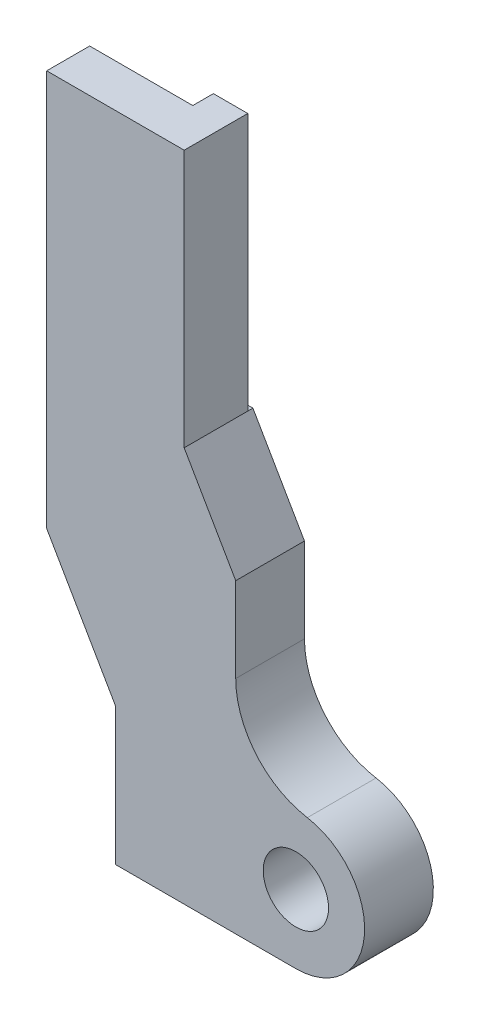
ISO-10303-21;
HEADER;
FILE_DESCRIPTION(('STEP AP214'),'2;1');
FILE_NAME('part.step','',(''),(''),'','','');
FILE_SCHEMA(('AUTOMOTIVE_DESIGN { 1 0 10303 214 1 1 1 1 }'));
ENDSEC;
DATA;
#1=APPLICATION_CONTEXT('core data for automotive mechanical design processes');
#2=APPLICATION_PROTOCOL_DEFINITION('international standard','automotive_design',2000,#1);
#3=PRODUCT_CONTEXT('',#1,'mechanical');
#4=PRODUCT('Part','Part','',(#3));
#5=PRODUCT_RELATED_PRODUCT_CATEGORY('part','',(#4));
#6=PRODUCT_DEFINITION_FORMATION('','',#4);
#7=PRODUCT_DEFINITION_CONTEXT('part definition',#1,'design');
#8=PRODUCT_DEFINITION('design','',#6,#7);
#9=PRODUCT_DEFINITION_SHAPE('','',#8);
#10=(LENGTH_UNIT() NAMED_UNIT(*) SI_UNIT(.MILLI.,.METRE.));
#11=(NAMED_UNIT(*) PLANE_ANGLE_UNIT() SI_UNIT($,.RADIAN.));
#12=(NAMED_UNIT(*) SI_UNIT($,.STERADIAN.) SOLID_ANGLE_UNIT());
#13=UNCERTAINTY_MEASURE_WITH_UNIT(LENGTH_MEASURE(1.E-05),#10,'distance_accuracy_value','');
#14=(GEOMETRIC_REPRESENTATION_CONTEXT(3) GLOBAL_UNCERTAINTY_ASSIGNED_CONTEXT((#13)) GLOBAL_UNIT_ASSIGNED_CONTEXT((#10,
#11,#12)) REPRESENTATION_CONTEXT('',''));
#15=CARTESIAN_POINT('',(0.,0.,0.));
#16=DIRECTION('',(0.,0.,1.));
#17=DIRECTION('',(1.,0.,0.));
#18=AXIS2_PLACEMENT_3D('',#15,#16,#17);
#19=CARTESIAN_POINT('',(-7.5,-4.,1.5));
#20=DIRECTION('',(0.,0.,1.));
#21=DIRECTION('',(1.,0.,0.));
#22=AXIS2_PLACEMENT_3D('',#19,#20,#21);
#23=PLANE('',#22);
#24=DIRECTION('',(0.5,-0.866025403784439,0.));
#25=VECTOR('',#24,1.);
#26=CARTESIAN_POINT('',(-8.5,4.,1.5));
#27=LINE('',#26,#25);
#28=CARTESIAN_POINT('',(-13.,11.79422863406,1.5));
#29=VERTEX_POINT('',#28);
#30=CARTESIAN_POINT('',(-8.5,4.,1.5));
#31=VERTEX_POINT('',#30);
#32=EDGE_CURVE('E220',#29,#31,#27,.T.);
#33=ORIENTED_EDGE('',*,*,#32,.F.);
#34=DIRECTION('',(0.,-1.,0.));
#35=VECTOR('',#34,1.);
#36=CARTESIAN_POINT('',(-13.,11.79422863406,1.5));
#37=LINE('',#36,#35);
#38=CARTESIAN_POINT('',(-13.,24.,1.5));
#39=VERTEX_POINT('',#38);
#40=EDGE_CURVE('E225',#39,#29,#37,.T.);
#41=ORIENTED_EDGE('',*,*,#40,.F.);
#42=DIRECTION('',(-1.,0.,0.));
#43=VECTOR('',#42,1.);
#44=CARTESIAN_POINT('',(-14.5,24.,1.5));
#45=LINE('',#44,#43);
#46=CARTESIAN_POINT('',(-14.5,24.,1.5));
#47=VERTEX_POINT('',#46);
#48=EDGE_CURVE('E482',#39,#47,#45,.T.);
#49=ORIENTED_EDGE('',*,*,#48,.T.);
#50=DIRECTION('',(0.,1.,0.));
#51=VECTOR('',#50,1.);
#52=CARTESIAN_POINT('',(-14.5,34.,1.5));
#53=LINE('',#52,#51);
#54=CARTESIAN_POINT('',(-14.5,34.,1.5));
#55=VERTEX_POINT('',#54);
#56=EDGE_CURVE('E473',#47,#55,#53,.T.);
#57=ORIENTED_EDGE('',*,*,#56,.T.);
#58=DIRECTION('',(1.,0.,0.));
#59=VECTOR('',#58,1.);
#60=CARTESIAN_POINT('',(-5.,34.,1.5));
#61=LINE('',#60,#59);
#62=CARTESIAN_POINT('',(-8.5,34.,1.5));
#63=VERTEX_POINT('',#62);
#64=EDGE_CURVE('E301',#55,#63,#61,.T.);
#65=ORIENTED_EDGE('',*,*,#64,.T.);
#66=DIRECTION('',(0.,-1.,0.));
#67=VECTOR('',#66,1.);
#68=CARTESIAN_POINT('',(-8.5,36.3323807579381,1.5));
#69=LINE('',#68,#67);
#70=CARTESIAN_POINT('',(-8.5,19.,1.5));
#71=VERTEX_POINT('',#70);
#72=EDGE_CURVE('E264',#63,#71,#69,.T.);
#73=ORIENTED_EDGE('',*,*,#72,.T.);
#74=DIRECTION('',(-0.499999999999995,0.866025403784442,0.));
#75=VECTOR('',#74,1.);
#76=CARTESIAN_POINT('',(-8.5,19.,1.5));
#77=LINE('',#76,#75);
#78=CARTESIAN_POINT('',(-4.5,12.0717967697244,1.5));
#79=VERTEX_POINT('',#78);
#80=EDGE_CURVE('E255',#79,#71,#77,.T.);
#81=ORIENTED_EDGE('',*,*,#80,.F.);
#82=DIRECTION('',(0.,1.,0.));
#83=VECTOR('',#82,1.);
#84=CARTESIAN_POINT('',(-4.5,-4.,1.5));
#85=LINE('',#84,#83);
#86=CARTESIAN_POINT('',(-4.5,-4.,1.5));
#87=VERTEX_POINT('',#86);
#88=EDGE_CURVE('E333',#87,#79,#85,.T.);
#89=ORIENTED_EDGE('',*,*,#88,.F.);
#90=DIRECTION('',(1.,0.,0.));
#91=VECTOR('',#90,1.);
#92=CARTESIAN_POINT('',(-7.5,-4.,1.5));
#93=LINE('',#92,#91);
#94=CARTESIAN_POINT('',(-7.5,-4.,1.5));
#95=VERTEX_POINT('',#94);
#96=EDGE_CURVE('E319',#95,#87,#93,.T.);
#97=ORIENTED_EDGE('',*,*,#96,.F.);
#98=DIRECTION('',(0.,1.,0.));
#99=VECTOR('',#98,1.);
#100=CARTESIAN_POINT('',(-7.5,-4.,1.5));
#101=LINE('',#100,#99);
#102=CARTESIAN_POINT('',(-7.5,4.,1.5));
#103=VERTEX_POINT('',#102);
#104=EDGE_CURVE('E325',#95,#103,#101,.T.);
#105=ORIENTED_EDGE('',*,*,#104,.T.);
#106=DIRECTION('',(-1.,0.,0.));
#107=VECTOR('',#106,1.);
#108=CARTESIAN_POINT('',(-5.,4.,1.5));
#109=LINE('',#108,#107);
#110=EDGE_CURVE('E299',#103,#31,#109,.T.);
#111=ORIENTED_EDGE('',*,*,#110,.T.);
#112=EDGE_LOOP('',(#33,#41,#49,#57,#65,#73,#81,#89,#97,#105,#111));
#113=FACE_BOUND('',#112,.T.);
#114=ADVANCED_FACE('F37',(#113),#23,.F.);
#115=CARTESIAN_POINT('',(0.,4.,4.));
#116=DIRECTION('',(0.,-1.,0.));
#117=DIRECTION('',(1.,0.,0.));
#118=AXIS2_PLACEMENT_3D('',#115,#116,#117);
#119=PLANE('',#118);
#120=DIRECTION('',(0.,0.,1.));
#121=VECTOR('',#120,1.);
#122=CARTESIAN_POINT('',(-8.5,4.,-31.5941170815567));
#123=LINE('',#122,#121);
#124=CARTESIAN_POINT('',(-8.5,4.,0.));
#125=VERTEX_POINT('',#124);
#126=EDGE_CURVE('E209',#125,#31,#123,.T.);
#127=ORIENTED_EDGE('',*,*,#126,.T.);
#128=ORIENTED_EDGE('',*,*,#110,.F.);
#129=DIRECTION('',(0.,0.,1.));
#130=VECTOR('',#129,1.);
#131=CARTESIAN_POINT('',(-7.5,4.,0.));
#132=LINE('',#131,#130);
#133=CARTESIAN_POINT('',(-7.5,4.,0.));
#134=VERTEX_POINT('',#133);
#135=EDGE_CURVE('E212',#134,#103,#132,.T.);
#136=ORIENTED_EDGE('',*,*,#135,.F.);
#137=DIRECTION('',(-1.,0.,0.));
#138=VECTOR('',#137,1.);
#139=CARTESIAN_POINT('',(0.,4.,0.));
#140=LINE('',#139,#138);
#141=EDGE_CURVE('E196',#134,#125,#140,.T.);
#142=ORIENTED_EDGE('',*,*,#141,.T.);
#143=EDGE_LOOP('',(#127,#128,#136,#142));
#144=FACE_BOUND('',#143,.T.);
#145=ADVANCED_FACE('F208',(#144),#119,.F.);
#146=CARTESIAN_POINT('',(-10.5,4.,4.));
#147=DIRECTION('',(1.,0.,0.));
#148=DIRECTION('',(0.,0.,-1.));
#149=AXIS2_PLACEMENT_3D('',#146,#147,#148);
#150=PLANE('',#149);
#151=DIRECTION('',(0.,-1.,0.));
#152=VECTOR('',#151,1.);
#153=CARTESIAN_POINT('',(-10.5,4.,4.));
#154=LINE('',#153,#152);
#155=CARTESIAN_POINT('',(-10.5,4.,4.));
#156=VERTEX_POINT('',#155);
#157=CARTESIAN_POINT('',(-10.5,-4.,4.));
#158=VERTEX_POINT('',#157);
#159=EDGE_CURVE('E345',#156,#158,#154,.T.);
#160=ORIENTED_EDGE('',*,*,#159,.F.);
#161=DIRECTION('',(0.,0.,-1.));
#162=VECTOR('',#161,1.);
#163=CARTESIAN_POINT('',(-10.5,4.,4.));
#164=LINE('',#163,#162);
#165=CARTESIAN_POINT('',(-10.5,4.,-1.));
#166=VERTEX_POINT('',#165);
#167=EDGE_CURVE('E357',#156,#166,#164,.T.);
#168=ORIENTED_EDGE('',*,*,#167,.T.);
#169=DIRECTION('',(0.,1.,0.));
#170=VECTOR('',#169,1.);
#171=CARTESIAN_POINT('',(-10.5,4.,-1.));
#172=LINE('',#171,#170);
#173=CARTESIAN_POINT('',(-10.5,-4.,-1.));
#174=VERTEX_POINT('',#173);
#175=EDGE_CURVE('E305',#174,#166,#172,.T.);
#176=ORIENTED_EDGE('',*,*,#175,.F.);
#177=DIRECTION('',(0.,0.,-1.));
#178=VECTOR('',#177,1.);
#179=CARTESIAN_POINT('',(-10.5,-4.,4.));
#180=LINE('',#179,#178);
#181=EDGE_CURVE('E355',#158,#174,#180,.T.);
#182=ORIENTED_EDGE('',*,*,#181,.F.);
#183=EDGE_LOOP('',(#160,#168,#176,#182));
#184=FACE_BOUND('',#183,.T.);
#185=ADVANCED_FACE('F404',(#184),#150,.F.);
#186=CARTESIAN_POINT('',(-4.5,-4.,0.));
#187=DIRECTION('',(1.,0.,0.));
#188=DIRECTION('',(0.,1.,0.));
#189=AXIS2_PLACEMENT_3D('',#186,#187,#188);
#190=PLANE('',#189);
#191=DIRECTION('',(0.,0.,1.));
#192=VECTOR('',#191,1.);
#193=CARTESIAN_POINT('',(-4.5,12.0717967697244,-8.00000000000009));
#194=LINE('',#193,#192);
#195=CARTESIAN_POINT('',(-4.5,12.0717967697244,0.));
#196=VERTEX_POINT('',#195);
#197=EDGE_CURVE('E260',#196,#79,#194,.T.);
#198=ORIENTED_EDGE('',*,*,#197,.F.);
#199=DIRECTION('',(0.,1.,0.));
#200=VECTOR('',#199,1.);
#201=CARTESIAN_POINT('',(-4.5,-4.,0.));
#202=LINE('',#201,#200);
#203=CARTESIAN_POINT('',(-4.5,-4.,0.));
#204=VERTEX_POINT('',#203);
#205=EDGE_CURVE('E330',#204,#196,#202,.T.);
#206=ORIENTED_EDGE('',*,*,#205,.F.);
#207=DIRECTION('',(0.,0.,-1.));
#208=VECTOR('',#207,1.);
#209=CARTESIAN_POINT('',(-4.5,-4.,0.));
#210=LINE('',#209,#208);
#211=EDGE_CURVE('E322',#87,#204,#210,.T.);
#212=ORIENTED_EDGE('',*,*,#211,.F.);
#213=ORIENTED_EDGE('',*,*,#88,.T.);
#214=EDGE_LOOP('',(#198,#206,#212,#213));
#215=FACE_BOUND('',#214,.T.);
#216=ADVANCED_FACE('F408',(#215),#190,.F.);
#217=CARTESIAN_POINT('',(0.,0.,0.));
#218=DIRECTION('',(0.,0.,1.));
#219=DIRECTION('',(1.,0.,0.));
#220=AXIS2_PLACEMENT_3D('',#217,#218,#219);
#221=PLANE('',#220);
#222=DIRECTION('',(0.,-1.,0.));
#223=VECTOR('',#222,1.);
#224=CARTESIAN_POINT('',(-9.5,4.,0.));
#225=LINE('',#224,#223);
#226=CARTESIAN_POINT('',(-9.5,5.73205080756888,0.));
#227=VERTEX_POINT('',#226);
#228=CARTESIAN_POINT('',(-9.5,-4.,0.));
#229=VERTEX_POINT('',#228);
#230=EDGE_CURVE('E199',#227,#229,#225,.T.);
#231=ORIENTED_EDGE('',*,*,#230,.F.);
#232=DIRECTION('',(0.5,-0.866025403784439,0.));
#233=VECTOR('',#232,1.);
#234=CARTESIAN_POINT('',(-9.79355865354369,6.24050931050806,0.));
#235=LINE('',#234,#233);
#236=EDGE_CURVE('E192',#227,#125,#235,.T.);
#237=ORIENTED_EDGE('',*,*,#236,.T.);
#238=ORIENTED_EDGE('',*,*,#141,.F.);
#239=DIRECTION('',(0.,1.,0.));
#240=VECTOR('',#239,1.);
#241=CARTESIAN_POINT('',(-7.5,-4.,0.));
#242=LINE('',#241,#240);
#243=CARTESIAN_POINT('',(-7.5,-4.,0.));
#244=VERTEX_POINT('',#243);
#245=EDGE_CURVE('E327',#244,#134,#242,.T.);
#246=ORIENTED_EDGE('',*,*,#245,.F.);
#247=DIRECTION('',(1.,0.,0.));
#248=VECTOR('',#247,1.);
#249=CARTESIAN_POINT('',(-10.5,-4.,0.));
#250=LINE('',#249,#248);
#251=EDGE_CURVE('E346',#229,#244,#250,.T.);
#252=ORIENTED_EDGE('',*,*,#251,.F.);
#253=EDGE_LOOP('',(#231,#237,#238,#246,#252));
#254=FACE_BOUND('',#253,.T.);
#255=ADVANCED_FACE('F194',(#254),#221,.F.);
#256=CARTESIAN_POINT('',(0.,0.,4.));
#257=DIRECTION('',(0.,0.,1.));
#258=DIRECTION('',(1.,0.,0.));
#259=AXIS2_PLACEMENT_3D('',#256,#257,#258);
#260=PLANE('',#259);
#261=DIRECTION('',(0.,1.,0.));
#262=VECTOR('',#261,1.);
#263=CARTESIAN_POINT('',(-6.5,34.,4.));
#264=LINE('',#263,#262);
#265=CARTESIAN_POINT('',(-6.5,19.,4.));
#266=VERTEX_POINT('',#265);
#267=CARTESIAN_POINT('',(-6.5,34.,4.));
#268=VERTEX_POINT('',#267);
#269=EDGE_CURVE('E248',#266,#268,#264,.T.);
#270=ORIENTED_EDGE('',*,*,#269,.T.);
#271=DIRECTION('',(-1.,0.,0.));
#272=VECTOR('',#271,1.);
#273=CARTESIAN_POINT('',(-5.,34.,4.));
#274=LINE('',#273,#272);
#275=CARTESIAN_POINT('',(-14.5,34.,4.));
#276=VERTEX_POINT('',#275);
#277=EDGE_CURVE('E298',#268,#276,#274,.T.);
#278=ORIENTED_EDGE('',*,*,#277,.T.);
#279=DIRECTION('',(0.,-1.,0.));
#280=VECTOR('',#279,1.);
#281=CARTESIAN_POINT('',(-14.5,34.,4.));
#282=LINE('',#281,#280);
#283=CARTESIAN_POINT('',(-14.5,10.9282032302755,4.));
#284=VERTEX_POINT('',#283);
#285=EDGE_CURVE('E231',#276,#284,#282,.T.);
#286=ORIENTED_EDGE('',*,*,#285,.T.);
#287=DIRECTION('',(0.5,-0.866025403784439,0.));
#288=VECTOR('',#287,1.);
#289=CARTESIAN_POINT('',(-14.5,10.9282032302755,4.));
#290=LINE('',#289,#288);
#291=EDGE_CURVE('E234',#284,#156,#290,.T.);
#292=ORIENTED_EDGE('',*,*,#291,.T.);
#293=ORIENTED_EDGE('',*,*,#159,.T.);
#294=DIRECTION('',(1.,0.,0.));
#295=VECTOR('',#294,1.);
#296=CARTESIAN_POINT('',(-10.5,-4.,4.));
#297=LINE('',#296,#295);
#298=CARTESIAN_POINT('',(0.,-4.,4.));
#299=VERTEX_POINT('',#298);
#300=EDGE_CURVE('E348',#158,#299,#297,.T.);
#301=ORIENTED_EDGE('',*,*,#300,.T.);
#302=CARTESIAN_POINT('',(0.,0.,4.));
#303=DIRECTION('',(0.,0.,1.));
#304=DIRECTION('',(1.,0.,0.));
#305=AXIS2_PLACEMENT_3D('',#302,#303,#304);
#306=CIRCLE('',#305,4.);
#307=CARTESIAN_POINT('',(0.666666666666667,3.94405318873308,4.));
#308=VERTEX_POINT('',#307);
#309=EDGE_CURVE('E343',#299,#308,#306,.T.);
#310=ORIENTED_EDGE('',*,*,#309,.T.);
#311=CARTESIAN_POINT('',(1.5,8.87411967464942,4.));
#312=DIRECTION('',(0.,0.,1.));
#313=DIRECTION('',(1.,0.,0.));
#314=AXIS2_PLACEMENT_3D('',#311,#312,#313);
#315=CIRCLE('',#314,5.);
#316=CARTESIAN_POINT('',(-3.5,8.87411967464942,4.));
#317=VERTEX_POINT('',#316);
#318=EDGE_CURVE('E11',#308,#317,#315,.F.);
#319=ORIENTED_EDGE('',*,*,#318,.T.);
#320=DIRECTION('',(0.,-1.,0.));
#321=VECTOR('',#320,1.);
#322=CARTESIAN_POINT('',(-3.5,19.,4.));
#323=LINE('',#322,#321);
#324=CARTESIAN_POINT('',(-3.5,13.8038475772934,4.));
#325=VERTEX_POINT('',#324);
#326=EDGE_CURVE('E295',#325,#317,#323,.T.);
#327=ORIENTED_EDGE('',*,*,#326,.F.);
#328=DIRECTION('',(-0.5,0.866025403784439,0.));
#329=VECTOR('',#328,1.);
#330=CARTESIAN_POINT('',(-6.5,19.,4.));
#331=LINE('',#330,#329);
#332=EDGE_CURVE('E245',#325,#266,#331,.T.);
#333=ORIENTED_EDGE('',*,*,#332,.T.);
#334=EDGE_LOOP('',(#270,#278,#286,#292,#293,#301,#310,#319,#327,#333));
#335=FACE_BOUND('',#334,.T.);
#336=CARTESIAN_POINT('',(0.,0.,4.));
#337=DIRECTION('',(0.,0.,1.));
#338=DIRECTION('',(1.,0.,0.));
#339=AXIS2_PLACEMENT_3D('',#336,#337,#338);
#340=CIRCLE('',#339,1.9);
#341=CARTESIAN_POINT('',(1.9,0.,4.));
#342=VERTEX_POINT('',#341);
#343=EDGE_CURVE('E338',#342,#342,#340,.T.);
#344=ORIENTED_EDGE('',*,*,#343,.F.);
#345=EDGE_LOOP('',(#344));
#346=FACE_BOUND('',#345,.T.);
#347=ADVANCED_FACE('F388',(#335,#346),#260,.T.);
#348=DIRECTION('',(-1.,0.,0.));
#349=VECTOR('',#348,1.);
#350=CARTESIAN_POINT('',(-3.5,19.,0.));
#351=LINE('',#350,#349);
#352=CARTESIAN_POINT('',(-6.5,19.,0.));
#353=VERTEX_POINT('',#352);
#354=CARTESIAN_POINT('',(-8.5,19.,0.));
#355=VERTEX_POINT('',#354);
#356=EDGE_CURVE('E280',#353,#355,#351,.T.);
#357=ORIENTED_EDGE('',*,*,#356,.F.);
#358=DIRECTION('',(-0.5,0.866025403784439,0.));
#359=VECTOR('',#358,1.);
#360=CARTESIAN_POINT('',(-6.5,19.,0.));
#361=LINE('',#360,#359);
#362=CARTESIAN_POINT('',(-3.5,13.8038475772934,0.));
#363=VERTEX_POINT('',#362);
#364=EDGE_CURVE('E251',#363,#353,#361,.T.);
#365=ORIENTED_EDGE('',*,*,#364,.F.);
#366=DIRECTION('',(0.,-1.,0.));
#367=VECTOR('',#366,1.);
#368=CARTESIAN_POINT('',(-3.5,19.,0.));
#369=LINE('',#368,#367);
#370=CARTESIAN_POINT('',(-3.5,8.87411967464942,0.));
#371=VERTEX_POINT('',#370);
#372=EDGE_CURVE('E293',#363,#371,#369,.T.);
#373=ORIENTED_EDGE('',*,*,#372,.T.);
#374=CARTESIAN_POINT('',(1.5,8.87411967464942,0.));
#375=DIRECTION('',(0.,0.,1.));
#376=DIRECTION('',(1.,0.,0.));
#377=AXIS2_PLACEMENT_3D('',#374,#375,#376);
#378=CIRCLE('',#377,5.);
#379=CARTESIAN_POINT('',(0.666666666666667,3.94405318873308,0.));
#380=VERTEX_POINT('',#379);
#381=EDGE_CURVE('E45',#371,#380,#378,.T.);
#382=ORIENTED_EDGE('',*,*,#381,.T.);
#383=CARTESIAN_POINT('',(0.,0.,0.));
#384=DIRECTION('',(0.,0.,1.));
#385=DIRECTION('',(1.,0.,0.));
#386=AXIS2_PLACEMENT_3D('',#383,#384,#385);
#387=CIRCLE('',#386,4.);
#388=CARTESIAN_POINT('',(0.,-4.,0.));
#389=VERTEX_POINT('',#388);
#390=EDGE_CURVE('E214',#389,#380,#387,.T.);
#391=ORIENTED_EDGE('',*,*,#390,.F.);
#392=EDGE_CURVE('E213',#204,#389,#250,.T.);
#393=ORIENTED_EDGE('',*,*,#392,.F.);
#394=ORIENTED_EDGE('',*,*,#205,.T.);
#395=DIRECTION('',(0.499999999999995,-0.866025403784442,0.));
#396=VECTOR('',#395,1.);
#397=CARTESIAN_POINT('',(-8.5,19.,0.));
#398=LINE('',#397,#396);
#399=EDGE_CURVE('E262',#355,#196,#398,.T.);
#400=ORIENTED_EDGE('',*,*,#399,.F.);
#401=EDGE_LOOP('',(#357,#365,#373,#382,#391,#393,#394,#400));
#402=FACE_BOUND('',#401,.T.);
#403=CARTESIAN_POINT('',(0.,0.,0.));
#404=DIRECTION('',(0.,0.,1.));
#405=DIRECTION('',(1.,0.,0.));
#406=AXIS2_PLACEMENT_3D('',#403,#404,#405);
#407=CIRCLE('',#406,1.9);
#408=CARTESIAN_POINT('',(1.9,0.,0.));
#409=VERTEX_POINT('',#408);
#410=EDGE_CURVE('E329',#409,#409,#407,.T.);
#411=ORIENTED_EDGE('',*,*,#410,.T.);
#412=EDGE_LOOP('',(#411));
#413=FACE_BOUND('',#412,.T.);
#414=ADVANCED_FACE('F372',(#402,#413),#221,.F.);
#415=CARTESIAN_POINT('',(0.,0.,4.));
#416=DIRECTION('',(0.,0.,-1.));
#417=DIRECTION('',(-1.,0.,0.));
#418=AXIS2_PLACEMENT_3D('',#415,#416,#417);
#419=CYLINDRICAL_SURFACE('',#418,4.);
#420=ORIENTED_EDGE('',*,*,#390,.T.);
#421=DIRECTION('',(0.,0.,-1.));
#422=VECTOR('',#421,1.);
#423=CARTESIAN_POINT('',(0.666666666666668,3.94405318873308,4.));
#424=LINE('',#423,#422);
#425=EDGE_CURVE('E52',#380,#308,#424,.F.);
#426=ORIENTED_EDGE('',*,*,#425,.T.);
#427=ORIENTED_EDGE('',*,*,#309,.F.);
#428=DIRECTION('',(0.,0.,-1.));
#429=VECTOR('',#428,1.);
#430=CARTESIAN_POINT('',(0.,-4.,4.));
#431=LINE('',#430,#429);
#432=EDGE_CURVE('E350',#299,#389,#431,.T.);
#433=ORIENTED_EDGE('',*,*,#432,.T.);
#434=EDGE_LOOP('',(#420,#426,#427,#433));
#435=FACE_BOUND('',#434,.T.);
#436=ADVANCED_FACE('F424',(#435),#419,.T.);
#437=CARTESIAN_POINT('',(-10.5,-4.,4.));
#438=DIRECTION('',(0.,1.,0.));
#439=DIRECTION('',(-1.,0.,0.));
#440=AXIS2_PLACEMENT_3D('',#437,#438,#439);
#441=PLANE('',#440);
#442=ORIENTED_EDGE('',*,*,#181,.T.);
#443=DIRECTION('',(-1.,0.,0.));
#444=VECTOR('',#443,1.);
#445=CARTESIAN_POINT('',(-10.5,-4.,-1.));
#446=LINE('',#445,#444);
#447=CARTESIAN_POINT('',(-9.5,-4.,-1.));
#448=VERTEX_POINT('',#447);
#449=EDGE_CURVE('E310',#448,#174,#446,.T.);
#450=ORIENTED_EDGE('',*,*,#449,.F.);
#451=DIRECTION('',(0.,0.,1.));
#452=VECTOR('',#451,1.);
#453=CARTESIAN_POINT('',(-9.5,-4.,-1.));
#454=LINE('',#453,#452);
#455=EDGE_CURVE('E313',#448,#229,#454,.T.);
#456=ORIENTED_EDGE('',*,*,#455,.T.);
#457=ORIENTED_EDGE('',*,*,#251,.T.);
#458=DIRECTION('',(0.,0.,1.));
#459=VECTOR('',#458,1.);
#460=CARTESIAN_POINT('',(-7.5,-4.,0.));
#461=LINE('',#460,#459);
#462=EDGE_CURVE('E316',#244,#95,#461,.T.);
#463=ORIENTED_EDGE('',*,*,#462,.T.);
#464=ORIENTED_EDGE('',*,*,#96,.T.);
#465=ORIENTED_EDGE('',*,*,#211,.T.);
#466=ORIENTED_EDGE('',*,*,#392,.T.);
#467=ORIENTED_EDGE('',*,*,#432,.F.);
#468=ORIENTED_EDGE('',*,*,#300,.F.);
#469=EDGE_LOOP('',(#442,#450,#456,#457,#463,#464,#465,#466,#467,#468));
#470=FACE_BOUND('',#469,.T.);
#471=ADVANCED_FACE('F418',(#470),#441,.F.);
#472=CARTESIAN_POINT('',(0.,0.,4.));
#473=DIRECTION('',(0.,0.,-1.));
#474=DIRECTION('',(-1.,0.,0.));
#475=AXIS2_PLACEMENT_3D('',#472,#473,#474);
#476=CYLINDRICAL_SURFACE('',#475,1.9);
#477=ORIENTED_EDGE('',*,*,#343,.T.);
#478=EDGE_LOOP('',(#477));
#479=FACE_BOUND('',#478,.T.);
#480=ORIENTED_EDGE('',*,*,#410,.F.);
#481=EDGE_LOOP('',(#480));
#482=FACE_BOUND('',#481,.T.);
#483=ADVANCED_FACE('F414',(#479,#482),#476,.F.);
#484=CARTESIAN_POINT('',(-7.5,-4.,0.));
#485=DIRECTION('',(-1.,0.,0.));
#486=DIRECTION('',(0.,-1.,0.));
#487=AXIS2_PLACEMENT_3D('',#484,#485,#486);
#488=PLANE('',#487);
#489=ORIENTED_EDGE('',*,*,#135,.T.);
#490=ORIENTED_EDGE('',*,*,#104,.F.);
#491=ORIENTED_EDGE('',*,*,#462,.F.);
#492=ORIENTED_EDGE('',*,*,#245,.T.);
#493=EDGE_LOOP('',(#489,#490,#491,#492));
#494=FACE_BOUND('',#493,.T.);
#495=ADVANCED_FACE('F410',(#494),#488,.F.);
#496=CARTESIAN_POINT('',(-9.5,4.,-1.));
#497=DIRECTION('',(-1.,0.,0.));
#498=DIRECTION('',(0.,-1.,0.));
#499=AXIS2_PLACEMENT_3D('',#496,#497,#498);
#500=PLANE('',#499);
#501=ORIENTED_EDGE('',*,*,#230,.T.);
#502=ORIENTED_EDGE('',*,*,#455,.F.);
#503=DIRECTION('',(0.,-1.,0.));
#504=VECTOR('',#503,1.);
#505=CARTESIAN_POINT('',(-9.5,4.,-1.));
#506=LINE('',#505,#504);
#507=CARTESIAN_POINT('',(-9.5,5.73205080756888,-1.));
#508=VERTEX_POINT('',#507);
#509=EDGE_CURVE('E308',#508,#448,#506,.T.);
#510=ORIENTED_EDGE('',*,*,#509,.F.);
#511=DIRECTION('',(0.,0.,1.));
#512=VECTOR('',#511,1.);
#513=CARTESIAN_POINT('',(-9.5,5.73205080756888,0.));
#514=LINE('',#513,#512);
#515=EDGE_CURVE('E204',#508,#227,#514,.T.);
#516=ORIENTED_EDGE('',*,*,#515,.T.);
#517=EDGE_LOOP('',(#501,#502,#510,#516));
#518=FACE_BOUND('',#517,.T.);
#519=ADVANCED_FACE('F413',(#518),#500,.F.);
#520=CARTESIAN_POINT('',(0.,0.,-1.));
#521=DIRECTION('',(0.,0.,1.));
#522=DIRECTION('',(1.,0.,0.));
#523=AXIS2_PLACEMENT_3D('',#520,#521,#522);
#524=PLANE('',#523);
#525=DIRECTION('',(-0.5,0.866025403784439,0.));
#526=VECTOR('',#525,1.);
#527=CARTESIAN_POINT('',(-8.5,4.,-1.));
#528=LINE('',#527,#526);
#529=CARTESIAN_POINT('',(-13.,11.79422863406,-1.));
#530=VERTEX_POINT('',#529);
#531=EDGE_CURVE('E223',#508,#530,#528,.T.);
#532=ORIENTED_EDGE('',*,*,#531,.F.);
#533=ORIENTED_EDGE('',*,*,#509,.T.);
#534=ORIENTED_EDGE('',*,*,#449,.T.);
#535=ORIENTED_EDGE('',*,*,#175,.T.);
#536=DIRECTION('',(0.5,-0.866025403784439,0.));
#537=VECTOR('',#536,1.);
#538=CARTESIAN_POINT('',(-14.5,10.9282032302755,-1.));
#539=LINE('',#538,#537);
#540=CARTESIAN_POINT('',(-14.5,10.9282032302755,-1.));
#541=VERTEX_POINT('',#540);
#542=EDGE_CURVE('E235',#541,#166,#539,.T.);
#543=ORIENTED_EDGE('',*,*,#542,.F.);
#544=DIRECTION('',(0.,-1.,0.));
#545=VECTOR('',#544,1.);
#546=CARTESIAN_POINT('',(-14.5,34.,-1.));
#547=LINE('',#546,#545);
#548=CARTESIAN_POINT('',(-14.5,24.,-1.));
#549=VERTEX_POINT('',#548);
#550=EDGE_CURVE('E460',#549,#541,#547,.T.);
#551=ORIENTED_EDGE('',*,*,#550,.F.);
#552=DIRECTION('',(-1.,0.,0.));
#553=VECTOR('',#552,1.);
#554=CARTESIAN_POINT('',(-14.5,24.,-1.));
#555=LINE('',#554,#553);
#556=CARTESIAN_POINT('',(-13.,24.,-1.));
#557=VERTEX_POINT('',#556);
#558=EDGE_CURVE('E486',#557,#549,#555,.T.);
#559=ORIENTED_EDGE('',*,*,#558,.F.);
#560=DIRECTION('',(0.,1.,0.));
#561=VECTOR('',#560,1.);
#562=CARTESIAN_POINT('',(-13.,11.79422863406,-1.));
#563=LINE('',#562,#561);
#564=EDGE_CURVE('E230',#530,#557,#563,.T.);
#565=ORIENTED_EDGE('',*,*,#564,.F.);
#566=EDGE_LOOP('',(#532,#533,#534,#535,#543,#551,#559,#565));
#567=FACE_BOUND('',#566,.T.);
#568=ADVANCED_FACE('F467',(#567),#524,.F.);
#569=CARTESIAN_POINT('',(-5.,34.,-29.));
#570=DIRECTION('',(0.,1.,0.));
#571=DIRECTION('',(0.,0.,1.));
#572=AXIS2_PLACEMENT_3D('',#569,#570,#571);
#573=PLANE('',#572);
#574=ORIENTED_EDGE('',*,*,#64,.F.);
#575=DIRECTION('',(0.,0.,1.));
#576=VECTOR('',#575,1.);
#577=CARTESIAN_POINT('',(-14.5,34.,-28.7654919008431));
#578=LINE('',#577,#576);
#579=EDGE_CURVE('E238',#55,#276,#578,.T.);
#580=ORIENTED_EDGE('',*,*,#579,.T.);
#581=ORIENTED_EDGE('',*,*,#277,.F.);
#582=DIRECTION('',(0.,0.,-1.));
#583=VECTOR('',#582,1.);
#584=CARTESIAN_POINT('',(-6.5,34.,0.300000000000001));
#585=LINE('',#584,#583);
#586=CARTESIAN_POINT('',(-6.5,34.,0.300000000000001));
#587=VERTEX_POINT('',#586);
#588=EDGE_CURVE('E281',#268,#587,#585,.T.);
#589=ORIENTED_EDGE('',*,*,#588,.T.);
#590=DIRECTION('',(-1.,0.,0.));
#591=VECTOR('',#590,1.);
#592=CARTESIAN_POINT('',(-8.5,34.,0.300000000000001));
#593=LINE('',#592,#591);
#594=CARTESIAN_POINT('',(-8.5,34.,0.300000000000001));
#595=VERTEX_POINT('',#594);
#596=EDGE_CURVE('E277',#587,#595,#593,.T.);
#597=ORIENTED_EDGE('',*,*,#596,.T.);
#598=DIRECTION('',(0.,0.,1.));
#599=VECTOR('',#598,1.);
#600=CARTESIAN_POINT('',(-8.5,34.,1.5));
#601=LINE('',#600,#599);
#602=EDGE_CURVE('E268',#595,#63,#601,.T.);
#603=ORIENTED_EDGE('',*,*,#602,.T.);
#604=EDGE_LOOP('',(#574,#580,#581,#589,#597,#603));
#605=FACE_BOUND('',#604,.T.);
#606=ADVANCED_FACE('F449',(#605),#573,.T.);
#607=CARTESIAN_POINT('',(-3.5,19.,4.));
#608=DIRECTION('',(-1.,0.,0.));
#609=DIRECTION('',(0.,-1.,0.));
#610=AXIS2_PLACEMENT_3D('',#607,#608,#609);
#611=PLANE('',#610);
#612=ORIENTED_EDGE('',*,*,#326,.T.);
#613=DIRECTION('',(0.,0.,1.));
#614=VECTOR('',#613,1.);
#615=CARTESIAN_POINT('',(-3.5,8.87411967464942,0.));
#616=LINE('',#615,#614);
#617=EDGE_CURVE('E359',#317,#371,#616,.F.);
#618=ORIENTED_EDGE('',*,*,#617,.T.);
#619=ORIENTED_EDGE('',*,*,#372,.F.);
#620=DIRECTION('',(0.,0.,-1.));
#621=VECTOR('',#620,1.);
#622=CARTESIAN_POINT('',(-3.5,13.8038475772934,4.001));
#623=LINE('',#622,#621);
#624=EDGE_CURVE('E253',#325,#363,#623,.T.);
#625=ORIENTED_EDGE('',*,*,#624,.F.);
#626=EDGE_LOOP('',(#612,#618,#619,#625));
#627=FACE_BOUND('',#626,.T.);
#628=ADVANCED_FACE('F365',(#627),#611,.F.);
#629=CARTESIAN_POINT('',(0.,19.,0.));
#630=DIRECTION('',(0.,1.,0.));
#631=DIRECTION('',(0.,0.,1.));
#632=AXIS2_PLACEMENT_3D('',#629,#630,#631);
#633=PLANE('',#632);
#634=DIRECTION('',(0.,0.,-1.));
#635=VECTOR('',#634,1.);
#636=CARTESIAN_POINT('',(-6.5,19.,4.001));
#637=LINE('',#636,#635);
#638=CARTESIAN_POINT('',(-6.5,19.,0.300000000000001));
#639=VERTEX_POINT('',#638);
#640=EDGE_CURVE('E241',#639,#353,#637,.T.);
#641=ORIENTED_EDGE('',*,*,#640,.T.);
#642=ORIENTED_EDGE('',*,*,#356,.T.);
#643=DIRECTION('',(0.,0.,1.));
#644=VECTOR('',#643,1.);
#645=CARTESIAN_POINT('',(-8.5,19.,-8.00000000000009));
#646=LINE('',#645,#644);
#647=CARTESIAN_POINT('',(-8.5,19.,0.300000000000002));
#648=VERTEX_POINT('',#647);
#649=EDGE_CURVE('E257',#355,#648,#646,.T.);
#650=ORIENTED_EDGE('',*,*,#649,.T.);
#651=DIRECTION('',(-1.,0.,0.));
#652=VECTOR('',#651,1.);
#653=CARTESIAN_POINT('',(-8.5,19.,0.300000000000001));
#654=LINE('',#653,#652);
#655=EDGE_CURVE('E270',#639,#648,#654,.T.);
#656=ORIENTED_EDGE('',*,*,#655,.F.);
#657=EDGE_LOOP('',(#641,#642,#650,#656));
#658=FACE_BOUND('',#657,.T.);
#659=ADVANCED_FACE('F379',(#658),#633,.T.);
#660=CARTESIAN_POINT('',(-6.5,36.3323807579381,0.300000000000001));
#661=DIRECTION('',(-1.,0.,0.));
#662=DIRECTION('',(0.,0.,1.));
#663=AXIS2_PLACEMENT_3D('',#660,#661,#662);
#664=PLANE('',#663);
#665=ORIENTED_EDGE('',*,*,#588,.F.);
#666=ORIENTED_EDGE('',*,*,#269,.F.);
#667=DIRECTION('',(0.,0.,-1.));
#668=VECTOR('',#667,1.);
#669=CARTESIAN_POINT('',(-6.5,19.,0.300000000000001));
#670=LINE('',#669,#668);
#671=EDGE_CURVE('E274',#266,#639,#670,.T.);
#672=ORIENTED_EDGE('',*,*,#671,.T.);
#673=DIRECTION('',(0.,-1.,0.));
#674=VECTOR('',#673,1.);
#675=CARTESIAN_POINT('',(-6.5,36.3323807579381,0.300000000000001));
#676=LINE('',#675,#674);
#677=EDGE_CURVE('E273',#587,#639,#676,.T.);
#678=ORIENTED_EDGE('',*,*,#677,.F.);
#679=EDGE_LOOP('',(#665,#666,#672,#678));
#680=FACE_BOUND('',#679,.T.);
#681=ADVANCED_FACE('F386',(#680),#664,.F.);
#682=CARTESIAN_POINT('',(-8.5,36.3323807579381,0.300000000000001));
#683=DIRECTION('',(0.,0.,1.));
#684=DIRECTION('',(1.,0.,0.));
#685=AXIS2_PLACEMENT_3D('',#682,#683,#684);
#686=PLANE('',#685);
#687=ORIENTED_EDGE('',*,*,#596,.F.);
#688=ORIENTED_EDGE('',*,*,#677,.T.);
#689=ORIENTED_EDGE('',*,*,#655,.T.);
#690=DIRECTION('',(0.,-1.,0.));
#691=VECTOR('',#690,1.);
#692=CARTESIAN_POINT('',(-8.5,36.3323807579381,0.300000000000001));
#693=LINE('',#692,#691);
#694=EDGE_CURVE('E269',#595,#648,#693,.T.);
#695=ORIENTED_EDGE('',*,*,#694,.F.);
#696=EDGE_LOOP('',(#687,#688,#689,#695));
#697=FACE_BOUND('',#696,.T.);
#698=ADVANCED_FACE('F383',(#697),#686,.F.);
#699=CARTESIAN_POINT('',(-8.5,36.3323807579381,1.5));
#700=DIRECTION('',(1.,0.,0.));
#701=DIRECTION('',(0.,0.,-1.));
#702=AXIS2_PLACEMENT_3D('',#699,#700,#701);
#703=PLANE('',#702);
#704=ORIENTED_EDGE('',*,*,#602,.F.);
#705=ORIENTED_EDGE('',*,*,#694,.T.);
#706=DIRECTION('',(0.,0.,1.));
#707=VECTOR('',#706,1.);
#708=CARTESIAN_POINT('',(-8.5,19.,1.5));
#709=LINE('',#708,#707);
#710=EDGE_CURVE('E265',#648,#71,#709,.T.);
#711=ORIENTED_EDGE('',*,*,#710,.T.);
#712=ORIENTED_EDGE('',*,*,#72,.F.);
#713=EDGE_LOOP('',(#704,#705,#711,#712));
#714=FACE_BOUND('',#713,.T.);
#715=ADVANCED_FACE('F447',(#714),#703,.F.);
#716=CARTESIAN_POINT('',(-8.5,19.,-8.00000000000009));
#717=DIRECTION('',(0.866025403784442,0.499999999999995,0.));
#718=DIRECTION('',(-0.499999999999995,0.866025403784442,0.));
#719=AXIS2_PLACEMENT_3D('',#716,#717,#718);
#720=PLANE('',#719);
#721=ORIENTED_EDGE('',*,*,#649,.F.);
#722=ORIENTED_EDGE('',*,*,#399,.T.);
#723=ORIENTED_EDGE('',*,*,#197,.T.);
#724=ORIENTED_EDGE('',*,*,#80,.T.);
#725=ORIENTED_EDGE('',*,*,#710,.F.);
#726=EDGE_LOOP('',(#721,#722,#723,#724,#725));
#727=FACE_BOUND('',#726,.T.);
#728=ADVANCED_FACE('F444',(#727),#720,.F.);
#729=CARTESIAN_POINT('',(-6.5,19.,4.001));
#730=DIRECTION('',(-0.866025403784439,-0.5,0.));
#731=DIRECTION('',(0.5,-0.866025403784439,0.));
#732=AXIS2_PLACEMENT_3D('',#729,#730,#731);
#733=PLANE('',#732);
#734=ORIENTED_EDGE('',*,*,#624,.T.);
#735=ORIENTED_EDGE('',*,*,#364,.T.);
#736=ORIENTED_EDGE('',*,*,#640,.F.);
#737=ORIENTED_EDGE('',*,*,#671,.F.);
#738=ORIENTED_EDGE('',*,*,#332,.F.);
#739=EDGE_LOOP('',(#734,#735,#736,#737,#738));
#740=FACE_BOUND('',#739,.T.);
#741=ADVANCED_FACE('F376',(#740),#733,.F.);
#742=CARTESIAN_POINT('',(-14.5,10.9282032302755,-28.7654919008431));
#743=DIRECTION('',(-0.866025403784438,-0.5,0.));
#744=DIRECTION('',(0.5,-0.866025403784439,0.));
#745=AXIS2_PLACEMENT_3D('',#742,#743,#744);
#746=PLANE('',#745);
#747=DIRECTION('',(0.,0.,1.));
#748=VECTOR('',#747,1.);
#749=CARTESIAN_POINT('',(-14.5,10.9282032302755,-28.7654919008431));
#750=LINE('',#749,#748);
#751=EDGE_CURVE('E239',#541,#284,#750,.T.);
#752=ORIENTED_EDGE('',*,*,#751,.F.);
#753=ORIENTED_EDGE('',*,*,#542,.T.);
#754=ORIENTED_EDGE('',*,*,#167,.F.);
#755=ORIENTED_EDGE('',*,*,#291,.F.);
#756=EDGE_LOOP('',(#752,#753,#754,#755));
#757=FACE_BOUND('',#756,.T.);
#758=ADVANCED_FACE('F464',(#757),#746,.T.);
#759=CARTESIAN_POINT('',(-14.5,34.,-28.7654919008431));
#760=DIRECTION('',(-1.,0.,0.));
#761=DIRECTION('',(0.,-1.,0.));
#762=AXIS2_PLACEMENT_3D('',#759,#760,#761);
#763=PLANE('',#762);
#764=ORIENTED_EDGE('',*,*,#56,.F.);
#765=DIRECTION('',(0.,0.,-1.));
#766=VECTOR('',#765,1.);
#767=CARTESIAN_POINT('',(-14.5,24.,11.6118742080783));
#768=LINE('',#767,#766);
#769=EDGE_CURVE('E479',#47,#549,#768,.T.);
#770=ORIENTED_EDGE('',*,*,#769,.T.);
#771=ORIENTED_EDGE('',*,*,#550,.T.);
#772=ORIENTED_EDGE('',*,*,#751,.T.);
#773=ORIENTED_EDGE('',*,*,#285,.F.);
#774=ORIENTED_EDGE('',*,*,#579,.F.);
#775=EDGE_LOOP('',(#764,#770,#771,#772,#773,#774));
#776=FACE_BOUND('',#775,.T.);
#777=ADVANCED_FACE('F456',(#776),#763,.T.);
#778=CARTESIAN_POINT('',(-8.5,4.,-31.5941170815567));
#779=DIRECTION('',(-0.866025403784439,-0.5,0.));
#780=DIRECTION('',(0.5,-0.866025403784439,0.));
#781=AXIS2_PLACEMENT_3D('',#778,#779,#780);
#782=PLANE('',#781);
#783=ORIENTED_EDGE('',*,*,#126,.F.);
#784=ORIENTED_EDGE('',*,*,#236,.F.);
#785=ORIENTED_EDGE('',*,*,#515,.F.);
#786=ORIENTED_EDGE('',*,*,#531,.T.);
#787=DIRECTION('',(0.,0.,1.));
#788=VECTOR('',#787,1.);
#789=CARTESIAN_POINT('',(-13.,11.79422863406,-31.5941170815567));
#790=LINE('',#789,#788);
#791=EDGE_CURVE('E221',#530,#29,#790,.T.);
#792=ORIENTED_EDGE('',*,*,#791,.T.);
#793=ORIENTED_EDGE('',*,*,#32,.T.);
#794=EDGE_LOOP('',(#783,#784,#785,#786,#792,#793));
#795=FACE_BOUND('',#794,.T.);
#796=ADVANCED_FACE('F217',(#795),#782,.F.);
#797=CARTESIAN_POINT('',(-13.,11.79422863406,-31.5941170815567));
#798=DIRECTION('',(-1.,0.,0.));
#799=DIRECTION('',(0.,-1.,0.));
#800=AXIS2_PLACEMENT_3D('',#797,#798,#799);
#801=PLANE('',#800);
#802=ORIENTED_EDGE('',*,*,#564,.T.);
#803=DIRECTION('',(0.,0.,-1.));
#804=VECTOR('',#803,1.);
#805=CARTESIAN_POINT('',(-13.,24.,11.6118742080783));
#806=LINE('',#805,#804);
#807=EDGE_CURVE('E488',#39,#557,#806,.T.);
#808=ORIENTED_EDGE('',*,*,#807,.F.);
#809=ORIENTED_EDGE('',*,*,#40,.T.);
#810=ORIENTED_EDGE('',*,*,#791,.F.);
#811=EDGE_LOOP('',(#802,#808,#809,#810));
#812=FACE_BOUND('',#811,.T.);
#813=ADVANCED_FACE('F395',(#812),#801,.F.);
#814=CARTESIAN_POINT('',(-14.5,24.,11.6118742080783));
#815=DIRECTION('',(0.,-1.,0.));
#816=DIRECTION('',(0.,0.,-1.));
#817=AXIS2_PLACEMENT_3D('',#814,#815,#816);
#818=PLANE('',#817);
#819=ORIENTED_EDGE('',*,*,#807,.T.);
#820=ORIENTED_EDGE('',*,*,#558,.T.);
#821=ORIENTED_EDGE('',*,*,#769,.F.);
#822=ORIENTED_EDGE('',*,*,#48,.F.);
#823=EDGE_LOOP('',(#819,#820,#821,#822));
#824=FACE_BOUND('',#823,.T.);
#825=ADVANCED_FACE('F391',(#824),#818,.F.);
#826=CARTESIAN_POINT('',(1.5,8.87411967464942,4.));
#827=DIRECTION('',(0.,0.,-1.));
#828=DIRECTION('',(-1.,0.,0.));
#829=AXIS2_PLACEMENT_3D('',#826,#827,#828);
#830=CYLINDRICAL_SURFACE('',#829,5.);
#831=ORIENTED_EDGE('',*,*,#318,.F.);
#832=ORIENTED_EDGE('',*,*,#425,.F.);
#833=ORIENTED_EDGE('',*,*,#381,.F.);
#834=ORIENTED_EDGE('',*,*,#617,.F.);
#835=EDGE_LOOP('',(#831,#832,#833,#834));
#836=FACE_BOUND('',#835,.T.);
#837=ADVANCED_FACE('F39',(#836),#830,.F.);
#838=CLOSED_SHELL('',(#114,#145,#185,#216,#255,#347,#414,#436,#471,#483,#495,#519,#568,#606,
#628,#659,#681,#698,#715,#728,#741,#758,#777,#796,#813,#825,#837));
#839=MANIFOLD_SOLID_BREP('B2',#838);
#840=ADVANCED_BREP_SHAPE_REPRESENTATION('',(#18,#839),#14);
#841=SHAPE_DEFINITION_REPRESENTATION(#9,#840);
ENDSEC;
END-ISO-10303-21;
